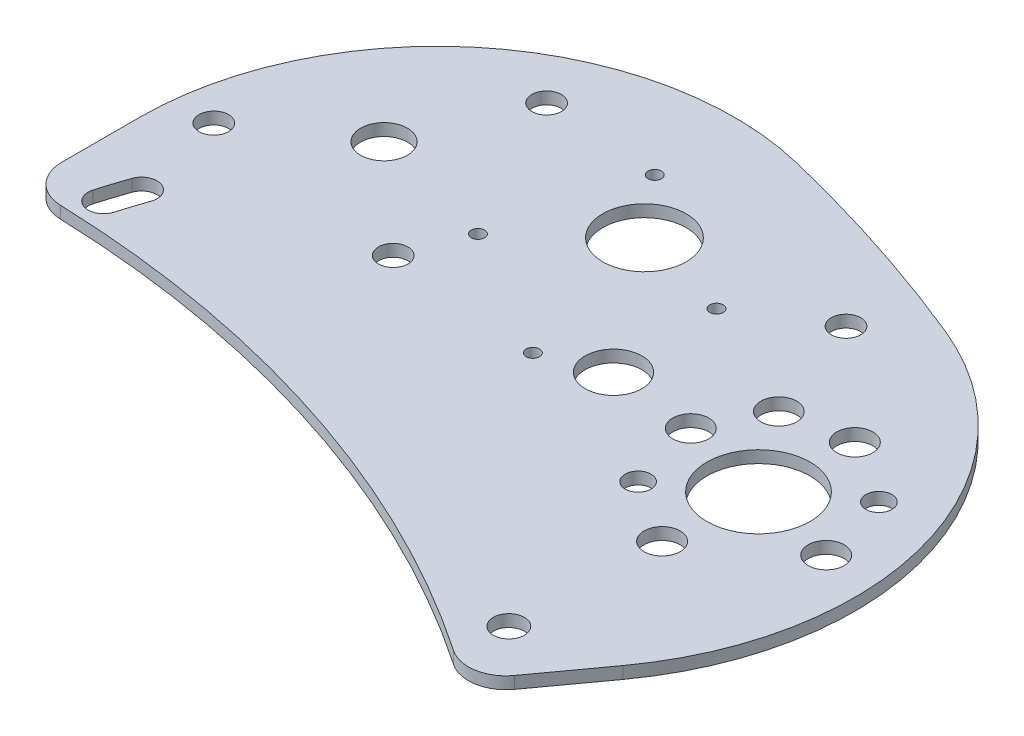
ISO-10303-21;
HEADER;
FILE_DESCRIPTION(('STEP AP214'),'2;1');
FILE_NAME('part.step','',(''),(''),'','','');
FILE_SCHEMA(('AUTOMOTIVE_DESIGN { 1 0 10303 214 1 1 1 1 }'));
ENDSEC;
DATA;
#1=APPLICATION_CONTEXT('core data for automotive mechanical design processes');
#2=APPLICATION_PROTOCOL_DEFINITION('international standard','automotive_design',2000,#1);
#3=PRODUCT_CONTEXT('',#1,'mechanical');
#4=PRODUCT('Part','Part','',(#3));
#5=PRODUCT_RELATED_PRODUCT_CATEGORY('part','',(#4));
#6=PRODUCT_DEFINITION_FORMATION('','',#4);
#7=PRODUCT_DEFINITION_CONTEXT('part definition',#1,'design');
#8=PRODUCT_DEFINITION('design','',#6,#7);
#9=PRODUCT_DEFINITION_SHAPE('','',#8);
#10=(LENGTH_UNIT() NAMED_UNIT(*) SI_UNIT(.MILLI.,.METRE.));
#11=(NAMED_UNIT(*) PLANE_ANGLE_UNIT() SI_UNIT($,.RADIAN.));
#12=(NAMED_UNIT(*) SI_UNIT($,.STERADIAN.) SOLID_ANGLE_UNIT());
#13=UNCERTAINTY_MEASURE_WITH_UNIT(LENGTH_MEASURE(1.E-05),#10,'distance_accuracy_value','');
#14=(GEOMETRIC_REPRESENTATION_CONTEXT(3) GLOBAL_UNCERTAINTY_ASSIGNED_CONTEXT((#13)) GLOBAL_UNIT_ASSIGNED_CONTEXT((#10,
#11,#12)) REPRESENTATION_CONTEXT('',''));
#15=CARTESIAN_POINT('',(0.,0.,0.));
#16=DIRECTION('',(0.,0.,1.));
#17=DIRECTION('',(1.,0.,0.));
#18=AXIS2_PLACEMENT_3D('',#15,#16,#17);
#19=CARTESIAN_POINT('',(0.,0.,0.));
#20=DIRECTION('',(0.,1.,0.));
#21=DIRECTION('',(0.,0.,1.));
#22=AXIS2_PLACEMENT_3D('',#19,#20,#21);
#23=PLANE('',#22);
#24=CARTESIAN_POINT('',(105.387653275408,0.,-162.282754897439));
#25=DIRECTION('',(0.,-1.,0.));
#26=DIRECTION('',(0.,0.,-1.));
#27=AXIS2_PLACEMENT_3D('',#24,#25,#26);
#28=CIRCLE('',#27,97.5467704546758);
#29=CARTESIAN_POINT('',(13.2052435141244,0.,-194.185352859675));
#30=VERTEX_POINT('',#29);
#31=CARTESIAN_POINT('',(11.7062790755721,0.,-189.470482904162));
#32=VERTEX_POINT('',#31);
#33=EDGE_CURVE('E300',#30,#32,#28,.F.);
#34=ORIENTED_EDGE('',*,*,#33,.F.);
#35=CARTESIAN_POINT('',(10.7329154268554,0.,-195.04097910337));
#36=DIRECTION('',(0.,-1.,0.));
#37=DIRECTION('',(0.,0.,-1.));
#38=AXIS2_PLACEMENT_3D('',#35,#36,#37);
#39=CIRCLE('',#38,2.61620000000001);
#40=CARTESIAN_POINT('',(8.26058733958649,0.,-195.896605347066));
#41=VERTEX_POINT('',#40);
#42=EDGE_CURVE('E287',#30,#41,#39,.F.);
#43=ORIENTED_EDGE('',*,*,#42,.T.);
#44=CARTESIAN_POINT('',(105.387653275408,0.,-162.282754897439));
#45=DIRECTION('',(0.,-1.,0.));
#46=DIRECTION('',(0.,0.,-1.));
#47=AXIS2_PLACEMENT_3D('',#44,#45,#46);
#48=CIRCLE('',#47,102.779170454676);
#49=CARTESIAN_POINT('',(6.68121858327241,0.,-190.928830190897));
#50=VERTEX_POINT('',#49);
#51=EDGE_CURVE('E291',#41,#50,#48,.F.);
#52=ORIENTED_EDGE('',*,*,#51,.T.);
#53=CARTESIAN_POINT('',(9.19374882942225,0.,-190.19965654753));
#54=DIRECTION('',(0.,-1.,0.));
#55=DIRECTION('',(0.,0.,-1.));
#56=AXIS2_PLACEMENT_3D('',#53,#54,#55);
#57=CIRCLE('',#56,2.61620000000001);
#58=EDGE_CURVE('E295',#50,#32,#57,.F.);
#59=ORIENTED_EDGE('',*,*,#58,.T.);
#60=EDGE_LOOP('',(#34,#43,#52,#59));
#61=FACE_BOUND('',#60,.T.);
#62=CARTESIAN_POINT('',(6.35,0.,-192.300185972349));
#63=DIRECTION('',(0.,-1.,0.));
#64=DIRECTION('',(0.,0.,-1.));
#65=AXIS2_PLACEMENT_3D('',#62,#63,#64);
#66=CIRCLE('',#65,6.34999999999999);
#67=CARTESIAN_POINT('',(0.,0.,-192.300185972349));
#68=VERTEX_POINT('',#67);
#69=CARTESIAN_POINT('',(6.14042904290429,0.,-185.953645181182));
#70=VERTEX_POINT('',#69);
#71=EDGE_CURVE('E135',#68,#70,#66,.F.);
#72=ORIENTED_EDGE('',*,*,#71,.F.);
#73=DIRECTION('',(0.,0.,-1.));
#74=VECTOR('',#73,1.);
#75=CARTESIAN_POINT('',(0.,0.,-261.62));
#76=LINE('',#75,#74);
#77=CARTESIAN_POINT('',(0.,0.,-205.418328782998));
#78=VERTEX_POINT('',#77);
#79=EDGE_CURVE('E126',#68,#78,#76,.T.);
#80=ORIENTED_EDGE('',*,*,#79,.T.);
#81=CARTESIAN_POINT('',(50.165,0.,-205.418328782998));
#82=DIRECTION('',(0.,-1.,0.));
#83=DIRECTION('',(0.,0.,-1.));
#84=AXIS2_PLACEMENT_3D('',#81,#82,#83);
#85=CIRCLE('',#84,50.165);
#86=CARTESIAN_POINT('',(62.066006006006,0.,-254.151205581367));
#87=VERTEX_POINT('',#86);
#88=EDGE_CURVE('E308',#87,#78,#85,.F.);
#89=ORIENTED_EDGE('',*,*,#88,.F.);
#90=CARTESIAN_POINT('',(0.,0.,0.));
#91=DIRECTION('',(0.,-1.,0.));
#92=DIRECTION('',(0.,0.,-1.));
#93=AXIS2_PLACEMENT_3D('',#90,#91,#92);
#94=CIRCLE('',#93,261.62);
#95=CARTESIAN_POINT('',(99.1738768612441,0.,-242.094127455233));
#96=VERTEX_POINT('',#95);
#97=EDGE_CURVE('E313',#96,#87,#94,.F.);
#98=ORIENTED_EDGE('',*,*,#97,.F.);
#99=CARTESIAN_POINT('',(80.1575266863939,0.,-195.673166122798));
#100=DIRECTION('',(0.,-1.,0.));
#101=DIRECTION('',(0.,0.,-1.));
#102=AXIS2_PLACEMENT_3D('',#99,#100,#101);
#103=CIRCLE('',#102,50.165);
#104=CARTESIAN_POINT('',(120.741864209213,0.,-166.186918941546));
#105=VERTEX_POINT('',#104);
#106=EDGE_CURVE('E318',#105,#96,#103,.F.);
#107=ORIENTED_EDGE('',*,*,#106,.F.);
#108=DIRECTION('',(-0.587785252292475,0.,0.809016994374946));
#109=VECTOR('',#108,1.);
#110=CARTESIAN_POINT('',(153.776377704757,0.,-211.655026068374));
#111=LINE('',#110,#109);
#112=CARTESIAN_POINT('',(113.031213327647,0.,-155.574118473093));
#113=VERTEX_POINT('',#112);
#114=EDGE_CURVE('E171',#105,#113,#111,.T.);
#115=ORIENTED_EDGE('',*,*,#114,.T.);
#116=CARTESIAN_POINT('',(107.893955413366,0.,-159.30655482515));
#117=DIRECTION('',(0.,-1.,0.));
#118=DIRECTION('',(0.,0.,-1.));
#119=AXIS2_PLACEMENT_3D('',#116,#117,#118);
#120=CIRCLE('',#119,6.34999999999999);
#121=CARTESIAN_POINT('',(104.333098799063,0.,-154.048912751713));
#122=VERTEX_POINT('',#121);
#123=EDGE_CURVE('E138',#122,#113,#120,.F.);
#124=ORIENTED_EDGE('',*,*,#123,.F.);
#125=CARTESIAN_POINT('',(0.,0.,0.));
#126=DIRECTION('',(0.,-1.,0.));
#127=DIRECTION('',(0.,0.,-1.));
#128=AXIS2_PLACEMENT_3D('',#125,#126,#127);
#129=CIRCLE('',#128,186.055);
#130=EDGE_CURVE('E132',#122,#70,#129,.F.);
#131=ORIENTED_EDGE('',*,*,#130,.T.);
#132=EDGE_LOOP('',(#72,#80,#89,#98,#107,#115,#124,#131));
#133=FACE_BOUND('',#132,.T.);
#134=CARTESIAN_POINT('',(105.387653275408,0.,-162.282754897439));
#135=DIRECTION('',(0.,-1.,0.));
#136=DIRECTION('',(0.,0.,-1.));
#137=AXIS2_PLACEMENT_3D('',#134,#135,#136);
#138=CIRCLE('',#137,2.61620000000001);
#139=CARTESIAN_POINT('',(105.387653275408,0.,-164.898954897439));
#140=VERTEX_POINT('',#139);
#141=EDGE_CURVE('E303',#140,#140,#138,.F.);
#142=ORIENTED_EDGE('',*,*,#141,.T.);
#143=EDGE_LOOP('',(#142));
#144=FACE_BOUND('',#143,.T.);
#145=CARTESIAN_POINT('',(106.79327598966,0.,-202.949339878046));
#146=DIRECTION('',(0.,1.,0.));
#147=DIRECTION('',(0.,0.,1.));
#148=AXIS2_PLACEMENT_3D('',#145,#146,#147);
#149=CIRCLE('',#148,8.68679999999994);
#150=CARTESIAN_POINT('',(106.79327598966,0.,-194.262539878046));
#151=VERTEX_POINT('',#150);
#152=EDGE_CURVE('E170',#151,#151,#149,.T.);
#153=ORIENTED_EDGE('',*,*,#152,.T.);
#154=EDGE_LOOP('',(#153));
#155=FACE_BOUND('',#154,.T.);
#156=CARTESIAN_POINT('',(96.7903973229225,0.,-216.384551797347));
#157=DIRECTION('',(0.,1.,0.));
#158=DIRECTION('',(0.,0.,1.));
#159=AXIS2_PLACEMENT_3D('',#156,#157,#158);
#160=CIRCLE('',#159,3.02260000000004);
#161=CARTESIAN_POINT('',(96.7903973229225,0.,-213.361951797347));
#162=VERTEX_POINT('',#161);
#163=EDGE_CURVE('E328',#162,#162,#160,.T.);
#164=ORIENTED_EDGE('',*,*,#163,.T.);
#165=EDGE_LOOP('',(#164));
#166=FACE_BOUND('',#165,.T.);
#167=CARTESIAN_POINT('',(77.135845718805,0.,-208.175495559979));
#168=DIRECTION('',(0.,1.,0.));
#169=DIRECTION('',(0.,0.,1.));
#170=AXIS2_PLACEMENT_3D('',#167,#168,#169);
#171=CIRCLE('',#170,4.78790000000001);
#172=CARTESIAN_POINT('',(77.135845718805,0.,-203.387595559979));
#173=VERTEX_POINT('',#172);
#174=EDGE_CURVE('E332',#173,#173,#171,.T.);
#175=ORIENTED_EDGE('',*,*,#174,.T.);
#176=EDGE_LOOP('',(#175));
#177=FACE_BOUND('',#176,.T.);
#178=CARTESIAN_POINT('',(60.1187805087684,0.,-230.411041087745));
#179=DIRECTION('',(0.,1.,0.));
#180=DIRECTION('',(0.,0.,1.));
#181=AXIS2_PLACEMENT_3D('',#178,#179,#180);
#182=CIRCLE('',#181,7.0231);
#183=CARTESIAN_POINT('',(60.1187805087684,0.,-223.387941087745));
#184=VERTEX_POINT('',#183);
#185=EDGE_CURVE('E336',#184,#184,#182,.T.);
#186=ORIENTED_EDGE('',*,*,#185,.T.);
#187=EDGE_LOOP('',(#186));
#188=FACE_BOUND('',#187,.T.);
#189=CARTESIAN_POINT('',(24.1516933288154,0.,-222.485289401648));
#190=DIRECTION('',(0.,1.,0.));
#191=DIRECTION('',(0.,0.,1.));
#192=AXIS2_PLACEMENT_3D('',#189,#190,#191);
#193=CIRCLE('',#192,3.9497);
#194=CARTESIAN_POINT('',(24.1516933288154,0.,-218.535589401648));
#195=VERTEX_POINT('',#194);
#196=EDGE_CURVE('E340',#195,#195,#193,.T.);
#197=ORIENTED_EDGE('',*,*,#196,.T.);
#198=EDGE_LOOP('',(#197));
#199=FACE_BOUND('',#198,.T.);
#200=CARTESIAN_POINT('',(7.09853202549333,0.,-210.855395159311));
#201=DIRECTION('',(0.,1.,0.));
#202=DIRECTION('',(0.,0.,1.));
#203=AXIS2_PLACEMENT_3D('',#200,#201,#202);
#204=CIRCLE('',#203,2.48920000000002);
#205=CARTESIAN_POINT('',(7.09853202549333,0.,-208.366195159311));
#206=VERTEX_POINT('',#205);
#207=EDGE_CURVE('E344',#206,#206,#204,.T.);
#208=ORIENTED_EDGE('',*,*,#207,.T.);
#209=EDGE_LOOP('',(#208));
#210=FACE_BOUND('',#209,.T.);
#211=CARTESIAN_POINT('',(118.423757894917,0.,-211.608548235366));
#212=DIRECTION('',(0.,1.,0.));
#213=DIRECTION('',(0.,0.,1.));
#214=AXIS2_PLACEMENT_3D('',#211,#212,#213);
#215=CIRCLE('',#214,2.18439999999998);
#216=CARTESIAN_POINT('',(118.423757894917,0.,-209.424148235366));
#217=VERTEX_POINT('',#216);
#218=EDGE_CURVE('E348',#217,#217,#215,.T.);
#219=ORIENTED_EDGE('',*,*,#218,.T.);
#220=EDGE_LOOP('',(#219));
#221=FACE_BOUND('',#220,.T.);
#222=CARTESIAN_POINT('',(95.1627940844023,0.,-194.290131520727));
#223=DIRECTION('',(0.,1.,0.));
#224=DIRECTION('',(0.,0.,1.));
#225=AXIS2_PLACEMENT_3D('',#222,#223,#224);
#226=CIRCLE('',#225,2.18439999999998);
#227=CARTESIAN_POINT('',(95.1627940844023,0.,-192.105731520727));
#228=VERTEX_POINT('',#227);
#229=EDGE_CURVE('E352',#228,#228,#226,.T.);
#230=ORIENTED_EDGE('',*,*,#229,.T.);
#231=EDGE_LOOP('',(#230));
#232=FACE_BOUND('',#231,.T.);
#233=CARTESIAN_POINT('',(107.686248355767,0.,-218.290372742667));
#234=DIRECTION('',(0.,1.,0.));
#235=DIRECTION('',(0.,0.,1.));
#236=AXIS2_PLACEMENT_3D('',#233,#234,#235);
#237=CIRCLE('',#236,3.03809996899998);
#238=CARTESIAN_POINT('',(107.686248355767,0.,-215.252272773667));
#239=VERTEX_POINT('',#238);
#240=EDGE_CURVE('E356',#239,#239,#237,.T.);
#241=ORIENTED_EDGE('',*,*,#240,.T.);
#242=EDGE_LOOP('',(#241));
#243=FACE_BOUND('',#242,.T.);
#244=CARTESIAN_POINT('',(91.8403709094479,0.,-206.492688387885));
#245=DIRECTION('',(0.,1.,0.));
#246=DIRECTION('',(0.,0.,1.));
#247=AXIS2_PLACEMENT_3D('',#244,#245,#246);
#248=CIRCLE('',#247,3.03809996899998);
#249=CARTESIAN_POINT('',(91.8403709094479,0.,-203.454588418885));
#250=VERTEX_POINT('',#249);
#251=EDGE_CURVE('E360',#250,#250,#248,.T.);
#252=ORIENTED_EDGE('',*,*,#251,.T.);
#253=EDGE_LOOP('',(#252));
#254=FACE_BOUND('',#253,.T.);
#255=CARTESIAN_POINT('',(105.900303623552,0.,-187.608307013426));
#256=DIRECTION('',(0.,1.,0.));
#257=DIRECTION('',(0.,0.,1.));
#258=AXIS2_PLACEMENT_3D('',#255,#256,#257);
#259=CIRCLE('',#258,3.03809996899998);
#260=CARTESIAN_POINT('',(105.900303623552,0.,-184.570207044426));
#261=VERTEX_POINT('',#260);
#262=EDGE_CURVE('E364',#261,#261,#259,.T.);
#263=ORIENTED_EDGE('',*,*,#262,.T.);
#264=EDGE_LOOP('',(#263));
#265=FACE_BOUND('',#264,.T.);
#266=CARTESIAN_POINT('',(121.746181069872,0.,-199.405991368208));
#267=DIRECTION('',(0.,1.,0.));
#268=DIRECTION('',(0.,0.,1.));
#269=AXIS2_PLACEMENT_3D('',#266,#267,#268);
#270=CIRCLE('',#269,3.03809996899998);
#271=CARTESIAN_POINT('',(121.746181069872,0.,-196.367891399208));
#272=VERTEX_POINT('',#271);
#273=EDGE_CURVE('E368',#272,#272,#270,.T.);
#274=ORIENTED_EDGE('',*,*,#273,.T.);
#275=EDGE_LOOP('',(#274));
#276=FACE_BOUND('',#275,.T.);
#277=CARTESIAN_POINT('',(90.0057910219011,0.,-234.478350866689));
#278=DIRECTION('',(0.,1.,0.));
#279=DIRECTION('',(0.,0.,1.));
#280=AXIS2_PLACEMENT_3D('',#277,#278,#279);
#281=CIRCLE('',#280,2.48920000000002);
#282=CARTESIAN_POINT('',(90.0057910219011,0.,-231.989150866689));
#283=VERTEX_POINT('',#282);
#284=EDGE_CURVE('E372',#283,#283,#281,.T.);
#285=ORIENTED_EDGE('',*,*,#284,.T.);
#286=EDGE_LOOP('',(#285));
#287=FACE_BOUND('',#286,.T.);
#288=CARTESIAN_POINT('',(32.202215271751,0.,-241.832152750685));
#289=DIRECTION('',(0.,1.,0.));
#290=DIRECTION('',(0.,0.,1.));
#291=AXIS2_PLACEMENT_3D('',#288,#289,#290);
#292=CIRCLE('',#291,2.4892);
#293=CARTESIAN_POINT('',(32.202215271751,0.,-239.342952750685));
#294=VERTEX_POINT('',#293);
#295=EDGE_CURVE('E376',#294,#294,#292,.T.);
#296=ORIENTED_EDGE('',*,*,#295,.T.);
#297=EDGE_LOOP('',(#296));
#298=FACE_BOUND('',#297,.T.);
#299=CARTESIAN_POINT('',(41.5214088040088,0.,-206.664163989377));
#300=DIRECTION('',(0.,1.,0.));
#301=DIRECTION('',(0.,0.,1.));
#302=AXIS2_PLACEMENT_3D('',#299,#300,#301);
#303=CIRCLE('',#302,2.4892);
#304=CARTESIAN_POINT('',(41.5214088040088,0.,-204.174963989377));
#305=VERTEX_POINT('',#304);
#306=EDGE_CURVE('E380',#305,#305,#303,.T.);
#307=ORIENTED_EDGE('',*,*,#306,.T.);
#308=EDGE_LOOP('',(#307));
#309=FACE_BOUND('',#308,.T.);
#310=CARTESIAN_POINT('',(45.5231581875763,0.,-216.941652759853));
#311=DIRECTION('',(0.,1.,0.));
#312=DIRECTION('',(0.,0.,1.));
#313=AXIS2_PLACEMENT_3D('',#310,#311,#312);
#314=CIRCLE('',#313,1.1303);
#315=CARTESIAN_POINT('',(45.5231581875763,0.,-215.811352759852));
#316=VERTEX_POINT('',#315);
#317=EDGE_CURVE('E384',#316,#316,#314,.T.);
#318=ORIENTED_EDGE('',*,*,#317,.T.);
#319=EDGE_LOOP('',(#318));
#320=FACE_BOUND('',#319,.T.);
#321=CARTESIAN_POINT('',(51.8012961391148,0.,-240.455957105536));
#322=DIRECTION('',(0.,1.,0.));
#323=DIRECTION('',(0.,0.,1.));
#324=AXIS2_PLACEMENT_3D('',#321,#322,#323);
#325=CIRCLE('',#324,1.1303);
#326=CARTESIAN_POINT('',(51.8012961391148,0.,-239.325657105536));
#327=VERTEX_POINT('',#326);
#328=EDGE_CURVE('E388',#327,#327,#325,.T.);
#329=ORIENTED_EDGE('',*,*,#328,.T.);
#330=EDGE_LOOP('',(#329));
#331=FACE_BOUND('',#330,.T.);
#332=CARTESIAN_POINT('',(67.5040399105149,0.,-204.21369775199));
#333=DIRECTION('',(0.,1.,0.));
#334=DIRECTION('',(0.,0.,1.));
#335=AXIS2_PLACEMENT_3D('',#332,#333,#334);
#336=CIRCLE('',#335,1.1303);
#337=CARTESIAN_POINT('',(67.5040399105149,0.,-203.08339775199));
#338=VERTEX_POINT('',#337);
#339=EDGE_CURVE('E391',#338,#338,#336,.T.);
#340=ORIENTED_EDGE('',*,*,#339,.T.);
#341=EDGE_LOOP('',(#340));
#342=FACE_BOUND('',#341,.T.);
#343=CARTESIAN_POINT('',(76.5297880774208,0.,-226.137007721691));
#344=DIRECTION('',(0.,1.,0.));
#345=DIRECTION('',(0.,0.,1.));
#346=AXIS2_PLACEMENT_3D('',#343,#344,#345);
#347=CIRCLE('',#346,1.1303);
#348=CARTESIAN_POINT('',(76.5297880774208,0.,-225.006707721691));
#349=VERTEX_POINT('',#348);
#350=EDGE_CURVE('E19',#349,#349,#347,.T.);
#351=ORIENTED_EDGE('',*,*,#350,.T.);
#352=EDGE_LOOP('',(#351));
#353=FACE_BOUND('',#352,.T.);
#354=ADVANCED_FACE('F16',(#61,#133,#144,#155,#166,#177,#188,#199,#210,#221,#232,#243,#254,#265,
#276,#287,#298,#309,#320,#331,#342,#353),#23,.F.);
#355=CARTESIAN_POINT('',(76.5297880774208,2.032,-226.137007721691));
#356=DIRECTION('',(0.,1.,0.));
#357=DIRECTION('',(0.,0.,1.));
#358=AXIS2_PLACEMENT_3D('',#355,#356,#357);
#359=CYLINDRICAL_SURFACE('',#358,1.1303);
#360=CARTESIAN_POINT('',(76.5297880774208,2.032,-226.137007721691));
#361=DIRECTION('',(0.,1.,0.));
#362=DIRECTION('',(0.,0.,1.));
#363=AXIS2_PLACEMENT_3D('',#360,#361,#362);
#364=CIRCLE('',#363,1.1303);
#365=CARTESIAN_POINT('',(76.5297880774208,2.032,-225.006707721691));
#366=VERTEX_POINT('',#365);
#367=EDGE_CURVE('E283',#366,#366,#364,.F.);
#368=ORIENTED_EDGE('',*,*,#367,.F.);
#369=EDGE_LOOP('',(#368));
#370=FACE_BOUND('',#369,.T.);
#371=ORIENTED_EDGE('',*,*,#350,.F.);
#372=EDGE_LOOP('',(#371));
#373=FACE_BOUND('',#372,.T.);
#374=ADVANCED_FACE('F401',(#370,#373),#359,.F.);
#375=CARTESIAN_POINT('',(67.5040399105149,2.032,-204.21369775199));
#376=DIRECTION('',(0.,1.,0.));
#377=DIRECTION('',(0.,0.,1.));
#378=AXIS2_PLACEMENT_3D('',#375,#376,#377);
#379=CYLINDRICAL_SURFACE('',#378,1.1303);
#380=CARTESIAN_POINT('',(67.5040399105149,2.032,-204.21369775199));
#381=DIRECTION('',(0.,1.,0.));
#382=DIRECTION('',(0.,0.,1.));
#383=AXIS2_PLACEMENT_3D('',#380,#381,#382);
#384=CIRCLE('',#383,1.1303);
#385=CARTESIAN_POINT('',(67.5040399105149,2.032,-203.08339775199));
#386=VERTEX_POINT('',#385);
#387=EDGE_CURVE('E279',#386,#386,#384,.F.);
#388=ORIENTED_EDGE('',*,*,#387,.F.);
#389=EDGE_LOOP('',(#388));
#390=FACE_BOUND('',#389,.T.);
#391=ORIENTED_EDGE('',*,*,#339,.F.);
#392=EDGE_LOOP('',(#391));
#393=FACE_BOUND('',#392,.T.);
#394=ADVANCED_FACE('F403',(#390,#393),#379,.F.);
#395=CARTESIAN_POINT('',(51.8012961391148,2.032,-240.455957105536));
#396=DIRECTION('',(0.,1.,0.));
#397=DIRECTION('',(0.,0.,1.));
#398=AXIS2_PLACEMENT_3D('',#395,#396,#397);
#399=CYLINDRICAL_SURFACE('',#398,1.1303);
#400=CARTESIAN_POINT('',(51.8012961391148,2.032,-240.455957105536));
#401=DIRECTION('',(0.,1.,0.));
#402=DIRECTION('',(0.,0.,1.));
#403=AXIS2_PLACEMENT_3D('',#400,#401,#402);
#404=CIRCLE('',#403,1.1303);
#405=CARTESIAN_POINT('',(51.8012961391148,2.032,-239.325657105536));
#406=VERTEX_POINT('',#405);
#407=EDGE_CURVE('E275',#406,#406,#404,.F.);
#408=ORIENTED_EDGE('',*,*,#407,.F.);
#409=EDGE_LOOP('',(#408));
#410=FACE_BOUND('',#409,.T.);
#411=ORIENTED_EDGE('',*,*,#328,.F.);
#412=EDGE_LOOP('',(#411));
#413=FACE_BOUND('',#412,.T.);
#414=ADVANCED_FACE('F410',(#410,#413),#399,.F.);
#415=CARTESIAN_POINT('',(45.5231581875763,2.032,-216.941652759853));
#416=DIRECTION('',(0.,1.,0.));
#417=DIRECTION('',(0.,0.,1.));
#418=AXIS2_PLACEMENT_3D('',#415,#416,#417);
#419=CYLINDRICAL_SURFACE('',#418,1.1303);
#420=CARTESIAN_POINT('',(45.5231581875763,2.032,-216.941652759853));
#421=DIRECTION('',(0.,1.,0.));
#422=DIRECTION('',(0.,0.,1.));
#423=AXIS2_PLACEMENT_3D('',#420,#421,#422);
#424=CIRCLE('',#423,1.1303);
#425=CARTESIAN_POINT('',(45.5231581875763,2.032,-215.811352759852));
#426=VERTEX_POINT('',#425);
#427=EDGE_CURVE('E271',#426,#426,#424,.F.);
#428=ORIENTED_EDGE('',*,*,#427,.F.);
#429=EDGE_LOOP('',(#428));
#430=FACE_BOUND('',#429,.T.);
#431=ORIENTED_EDGE('',*,*,#317,.F.);
#432=EDGE_LOOP('',(#431));
#433=FACE_BOUND('',#432,.T.);
#434=ADVANCED_FACE('F529',(#430,#433),#419,.F.);
#435=CARTESIAN_POINT('',(41.5214088040088,-7.04052079891829,-206.664163989377));
#436=DIRECTION('',(0.,1.,0.));
#437=DIRECTION('',(0.,0.,1.));
#438=AXIS2_PLACEMENT_3D('',#435,#436,#437);
#439=CYLINDRICAL_SURFACE('',#438,2.4892);
#440=CARTESIAN_POINT('',(41.5214088040088,2.032,-206.664163989377));
#441=DIRECTION('',(0.,1.,0.));
#442=DIRECTION('',(0.,0.,1.));
#443=AXIS2_PLACEMENT_3D('',#440,#441,#442);
#444=CIRCLE('',#443,2.4892);
#445=CARTESIAN_POINT('',(41.5214088040088,2.032,-204.174963989377));
#446=VERTEX_POINT('',#445);
#447=EDGE_CURVE('E267',#446,#446,#444,.F.);
#448=ORIENTED_EDGE('',*,*,#447,.F.);
#449=EDGE_LOOP('',(#448));
#450=FACE_BOUND('',#449,.T.);
#451=ORIENTED_EDGE('',*,*,#306,.F.);
#452=EDGE_LOOP('',(#451));
#453=FACE_BOUND('',#452,.T.);
#454=ADVANCED_FACE('F525',(#450,#453),#439,.F.);
#455=CARTESIAN_POINT('',(32.202215271751,-7.04052079891829,-241.832152750685));
#456=DIRECTION('',(0.,1.,0.));
#457=DIRECTION('',(0.,0.,1.));
#458=AXIS2_PLACEMENT_3D('',#455,#456,#457);
#459=CYLINDRICAL_SURFACE('',#458,2.4892);
#460=CARTESIAN_POINT('',(32.202215271751,2.032,-241.832152750685));
#461=DIRECTION('',(0.,1.,0.));
#462=DIRECTION('',(0.,0.,1.));
#463=AXIS2_PLACEMENT_3D('',#460,#461,#462);
#464=CIRCLE('',#463,2.4892);
#465=CARTESIAN_POINT('',(32.202215271751,2.032,-239.342952750685));
#466=VERTEX_POINT('',#465);
#467=EDGE_CURVE('E263',#466,#466,#464,.F.);
#468=ORIENTED_EDGE('',*,*,#467,.F.);
#469=EDGE_LOOP('',(#468));
#470=FACE_BOUND('',#469,.T.);
#471=ORIENTED_EDGE('',*,*,#295,.F.);
#472=EDGE_LOOP('',(#471));
#473=FACE_BOUND('',#472,.T.);
#474=ADVANCED_FACE('F521',(#470,#473),#459,.F.);
#475=CARTESIAN_POINT('',(90.0057910219011,-7.04052079891829,-234.478350866689));
#476=DIRECTION('',(0.,1.,0.));
#477=DIRECTION('',(0.,0.,1.));
#478=AXIS2_PLACEMENT_3D('',#475,#476,#477);
#479=CYLINDRICAL_SURFACE('',#478,2.48920000000002);
#480=CARTESIAN_POINT('',(90.0057910219011,2.032,-234.478350866689));
#481=DIRECTION('',(0.,1.,0.));
#482=DIRECTION('',(0.,0.,1.));
#483=AXIS2_PLACEMENT_3D('',#480,#481,#482);
#484=CIRCLE('',#483,2.48920000000002);
#485=CARTESIAN_POINT('',(90.0057910219011,2.032,-231.989150866689));
#486=VERTEX_POINT('',#485);
#487=EDGE_CURVE('E259',#486,#486,#484,.F.);
#488=ORIENTED_EDGE('',*,*,#487,.F.);
#489=EDGE_LOOP('',(#488));
#490=FACE_BOUND('',#489,.T.);
#491=ORIENTED_EDGE('',*,*,#284,.F.);
#492=EDGE_LOOP('',(#491));
#493=FACE_BOUND('',#492,.T.);
#494=ADVANCED_FACE('F517',(#490,#493),#479,.F.);
#495=CARTESIAN_POINT('',(121.746181069872,-8.59304436001012,-199.405991368208));
#496=DIRECTION('',(0.,1.,0.));
#497=DIRECTION('',(0.,0.,1.));
#498=AXIS2_PLACEMENT_3D('',#495,#496,#497);
#499=CYLINDRICAL_SURFACE('',#498,3.03809996899998);
#500=CARTESIAN_POINT('',(121.746181069872,2.032,-199.405991368208));
#501=DIRECTION('',(0.,1.,0.));
#502=DIRECTION('',(0.,0.,1.));
#503=AXIS2_PLACEMENT_3D('',#500,#501,#502);
#504=CIRCLE('',#503,3.03809996899998);
#505=CARTESIAN_POINT('',(121.746181069872,2.032,-196.367891399208));
#506=VERTEX_POINT('',#505);
#507=EDGE_CURVE('E255',#506,#506,#504,.F.);
#508=ORIENTED_EDGE('',*,*,#507,.F.);
#509=EDGE_LOOP('',(#508));
#510=FACE_BOUND('',#509,.T.);
#511=ORIENTED_EDGE('',*,*,#273,.F.);
#512=EDGE_LOOP('',(#511));
#513=FACE_BOUND('',#512,.T.);
#514=ADVANCED_FACE('F513',(#510,#513),#499,.F.);
#515=CARTESIAN_POINT('',(105.900303623552,-8.59304436001012,-187.608307013426));
#516=DIRECTION('',(0.,1.,0.));
#517=DIRECTION('',(0.,0.,1.));
#518=AXIS2_PLACEMENT_3D('',#515,#516,#517);
#519=CYLINDRICAL_SURFACE('',#518,3.03809996899998);
#520=CARTESIAN_POINT('',(105.900303623552,2.032,-187.608307013426));
#521=DIRECTION('',(0.,1.,0.));
#522=DIRECTION('',(0.,0.,1.));
#523=AXIS2_PLACEMENT_3D('',#520,#521,#522);
#524=CIRCLE('',#523,3.03809996899998);
#525=CARTESIAN_POINT('',(105.900303623552,2.032,-184.570207044426));
#526=VERTEX_POINT('',#525);
#527=EDGE_CURVE('E251',#526,#526,#524,.F.);
#528=ORIENTED_EDGE('',*,*,#527,.F.);
#529=EDGE_LOOP('',(#528));
#530=FACE_BOUND('',#529,.T.);
#531=ORIENTED_EDGE('',*,*,#262,.F.);
#532=EDGE_LOOP('',(#531));
#533=FACE_BOUND('',#532,.T.);
#534=ADVANCED_FACE('F509',(#530,#533),#519,.F.);
#535=CARTESIAN_POINT('',(91.8403709094479,-8.59304436001012,-206.492688387885));
#536=DIRECTION('',(0.,1.,0.));
#537=DIRECTION('',(0.,0.,1.));
#538=AXIS2_PLACEMENT_3D('',#535,#536,#537);
#539=CYLINDRICAL_SURFACE('',#538,3.03809996899998);
#540=CARTESIAN_POINT('',(91.8403709094479,2.032,-206.492688387885));
#541=DIRECTION('',(0.,1.,0.));
#542=DIRECTION('',(0.,0.,1.));
#543=AXIS2_PLACEMENT_3D('',#540,#541,#542);
#544=CIRCLE('',#543,3.03809996899998);
#545=CARTESIAN_POINT('',(91.8403709094479,2.032,-203.454588418885));
#546=VERTEX_POINT('',#545);
#547=EDGE_CURVE('E247',#546,#546,#544,.F.);
#548=ORIENTED_EDGE('',*,*,#547,.F.);
#549=EDGE_LOOP('',(#548));
#550=FACE_BOUND('',#549,.T.);
#551=ORIENTED_EDGE('',*,*,#251,.F.);
#552=EDGE_LOOP('',(#551));
#553=FACE_BOUND('',#552,.T.);
#554=ADVANCED_FACE('F505',(#550,#553),#539,.F.);
#555=CARTESIAN_POINT('',(107.686248355767,-8.59304436001012,-218.290372742667));
#556=DIRECTION('',(0.,1.,0.));
#557=DIRECTION('',(0.,0.,1.));
#558=AXIS2_PLACEMENT_3D('',#555,#556,#557);
#559=CYLINDRICAL_SURFACE('',#558,3.03809996899998);
#560=CARTESIAN_POINT('',(107.686248355767,2.032,-218.290372742667));
#561=DIRECTION('',(0.,1.,0.));
#562=DIRECTION('',(0.,0.,1.));
#563=AXIS2_PLACEMENT_3D('',#560,#561,#562);
#564=CIRCLE('',#563,3.03809996899998);
#565=CARTESIAN_POINT('',(107.686248355767,2.032,-215.252272773667));
#566=VERTEX_POINT('',#565);
#567=EDGE_CURVE('E243',#566,#566,#564,.F.);
#568=ORIENTED_EDGE('',*,*,#567,.F.);
#569=EDGE_LOOP('',(#568));
#570=FACE_BOUND('',#569,.T.);
#571=ORIENTED_EDGE('',*,*,#240,.F.);
#572=EDGE_LOOP('',(#571));
#573=FACE_BOUND('',#572,.T.);
#574=ADVANCED_FACE('F501',(#570,#573),#559,.F.);
#575=CARTESIAN_POINT('',(95.1627940844023,-8.59304436001012,-194.290131520727));
#576=DIRECTION('',(0.,1.,0.));
#577=DIRECTION('',(0.,0.,1.));
#578=AXIS2_PLACEMENT_3D('',#575,#576,#577);
#579=CYLINDRICAL_SURFACE('',#578,2.18439999999998);
#580=CARTESIAN_POINT('',(95.1627940844023,2.032,-194.290131520727));
#581=DIRECTION('',(0.,1.,0.));
#582=DIRECTION('',(0.,0.,1.));
#583=AXIS2_PLACEMENT_3D('',#580,#581,#582);
#584=CIRCLE('',#583,2.18439999999998);
#585=CARTESIAN_POINT('',(95.1627940844023,2.032,-192.105731520727));
#586=VERTEX_POINT('',#585);
#587=EDGE_CURVE('E239',#586,#586,#584,.F.);
#588=ORIENTED_EDGE('',*,*,#587,.F.);
#589=EDGE_LOOP('',(#588));
#590=FACE_BOUND('',#589,.T.);
#591=ORIENTED_EDGE('',*,*,#229,.F.);
#592=EDGE_LOOP('',(#591));
#593=FACE_BOUND('',#592,.T.);
#594=ADVANCED_FACE('F497',(#590,#593),#579,.F.);
#595=CARTESIAN_POINT('',(118.423757894917,-8.59304436001012,-211.608548235366));
#596=DIRECTION('',(0.,1.,0.));
#597=DIRECTION('',(0.,0.,1.));
#598=AXIS2_PLACEMENT_3D('',#595,#596,#597);
#599=CYLINDRICAL_SURFACE('',#598,2.18439999999998);
#600=CARTESIAN_POINT('',(118.423757894917,2.032,-211.608548235366));
#601=DIRECTION('',(0.,1.,0.));
#602=DIRECTION('',(0.,0.,1.));
#603=AXIS2_PLACEMENT_3D('',#600,#601,#602);
#604=CIRCLE('',#603,2.18439999999998);
#605=CARTESIAN_POINT('',(118.423757894917,2.032,-209.424148235366));
#606=VERTEX_POINT('',#605);
#607=EDGE_CURVE('E235',#606,#606,#604,.F.);
#608=ORIENTED_EDGE('',*,*,#607,.F.);
#609=EDGE_LOOP('',(#608));
#610=FACE_BOUND('',#609,.T.);
#611=ORIENTED_EDGE('',*,*,#218,.F.);
#612=EDGE_LOOP('',(#611));
#613=FACE_BOUND('',#612,.T.);
#614=ADVANCED_FACE('F493',(#610,#613),#599,.F.);
#615=CARTESIAN_POINT('',(7.09853202549333,-24.5699807472451,-210.855395159311));
#616=DIRECTION('',(0.,1.,0.));
#617=DIRECTION('',(0.,0.,1.));
#618=AXIS2_PLACEMENT_3D('',#615,#616,#617);
#619=CYLINDRICAL_SURFACE('',#618,2.48920000000002);
#620=CARTESIAN_POINT('',(7.09853202549333,2.032,-210.855395159311));
#621=DIRECTION('',(0.,1.,0.));
#622=DIRECTION('',(0.,0.,1.));
#623=AXIS2_PLACEMENT_3D('',#620,#621,#622);
#624=CIRCLE('',#623,2.48920000000002);
#625=CARTESIAN_POINT('',(7.09853202549333,2.032,-208.366195159311));
#626=VERTEX_POINT('',#625);
#627=EDGE_CURVE('E231',#626,#626,#624,.F.);
#628=ORIENTED_EDGE('',*,*,#627,.F.);
#629=EDGE_LOOP('',(#628));
#630=FACE_BOUND('',#629,.T.);
#631=ORIENTED_EDGE('',*,*,#207,.F.);
#632=EDGE_LOOP('',(#631));
#633=FACE_BOUND('',#632,.T.);
#634=ADVANCED_FACE('F489',(#630,#633),#619,.F.);
#635=CARTESIAN_POINT('',(24.1516933288154,-24.5699807472451,-222.485289401648));
#636=DIRECTION('',(0.,1.,0.));
#637=DIRECTION('',(0.,0.,1.));
#638=AXIS2_PLACEMENT_3D('',#635,#636,#637);
#639=CYLINDRICAL_SURFACE('',#638,3.9497);
#640=CARTESIAN_POINT('',(24.1516933288154,2.032,-222.485289401648));
#641=DIRECTION('',(0.,1.,0.));
#642=DIRECTION('',(0.,0.,1.));
#643=AXIS2_PLACEMENT_3D('',#640,#641,#642);
#644=CIRCLE('',#643,3.9497);
#645=CARTESIAN_POINT('',(24.1516933288154,2.032,-218.535589401648));
#646=VERTEX_POINT('',#645);
#647=EDGE_CURVE('E227',#646,#646,#644,.F.);
#648=ORIENTED_EDGE('',*,*,#647,.F.);
#649=EDGE_LOOP('',(#648));
#650=FACE_BOUND('',#649,.T.);
#651=ORIENTED_EDGE('',*,*,#196,.F.);
#652=EDGE_LOOP('',(#651));
#653=FACE_BOUND('',#652,.T.);
#654=ADVANCED_FACE('F485',(#650,#653),#639,.F.);
#655=CARTESIAN_POINT('',(60.1187805087684,-24.5699807472451,-230.411041087745));
#656=DIRECTION('',(0.,1.,0.));
#657=DIRECTION('',(0.,0.,1.));
#658=AXIS2_PLACEMENT_3D('',#655,#656,#657);
#659=CYLINDRICAL_SURFACE('',#658,7.0231);
#660=CARTESIAN_POINT('',(60.1187805087684,2.032,-230.411041087745));
#661=DIRECTION('',(0.,1.,0.));
#662=DIRECTION('',(0.,0.,1.));
#663=AXIS2_PLACEMENT_3D('',#660,#661,#662);
#664=CIRCLE('',#663,7.0231);
#665=CARTESIAN_POINT('',(60.1187805087684,2.032,-223.387941087745));
#666=VERTEX_POINT('',#665);
#667=EDGE_CURVE('E223',#666,#666,#664,.F.);
#668=ORIENTED_EDGE('',*,*,#667,.F.);
#669=EDGE_LOOP('',(#668));
#670=FACE_BOUND('',#669,.T.);
#671=ORIENTED_EDGE('',*,*,#185,.F.);
#672=EDGE_LOOP('',(#671));
#673=FACE_BOUND('',#672,.T.);
#674=ADVANCED_FACE('F481',(#670,#673),#659,.F.);
#675=CARTESIAN_POINT('',(77.135845718805,-24.5699807472451,-208.175495559979));
#676=DIRECTION('',(0.,1.,0.));
#677=DIRECTION('',(0.,0.,1.));
#678=AXIS2_PLACEMENT_3D('',#675,#676,#677);
#679=CYLINDRICAL_SURFACE('',#678,4.78790000000001);
#680=CARTESIAN_POINT('',(77.135845718805,2.032,-208.175495559979));
#681=DIRECTION('',(0.,1.,0.));
#682=DIRECTION('',(0.,0.,1.));
#683=AXIS2_PLACEMENT_3D('',#680,#681,#682);
#684=CIRCLE('',#683,4.78790000000001);
#685=CARTESIAN_POINT('',(77.135845718805,2.032,-203.387595559979));
#686=VERTEX_POINT('',#685);
#687=EDGE_CURVE('E219',#686,#686,#684,.F.);
#688=ORIENTED_EDGE('',*,*,#687,.F.);
#689=EDGE_LOOP('',(#688));
#690=FACE_BOUND('',#689,.T.);
#691=ORIENTED_EDGE('',*,*,#174,.F.);
#692=EDGE_LOOP('',(#691));
#693=FACE_BOUND('',#692,.T.);
#694=ADVANCED_FACE('F477',(#690,#693),#679,.F.);
#695=CARTESIAN_POINT('',(96.7903973229225,-24.5699807472451,-216.384551797347));
#696=DIRECTION('',(0.,1.,0.));
#697=DIRECTION('',(0.,0.,1.));
#698=AXIS2_PLACEMENT_3D('',#695,#696,#697);
#699=CYLINDRICAL_SURFACE('',#698,3.02260000000004);
#700=CARTESIAN_POINT('',(96.7903973229225,2.032,-216.384551797347));
#701=DIRECTION('',(0.,1.,0.));
#702=DIRECTION('',(0.,0.,1.));
#703=AXIS2_PLACEMENT_3D('',#700,#701,#702);
#704=CIRCLE('',#703,3.02260000000004);
#705=CARTESIAN_POINT('',(96.7903973229225,2.032,-213.361951797347));
#706=VERTEX_POINT('',#705);
#707=EDGE_CURVE('E215',#706,#706,#704,.F.);
#708=ORIENTED_EDGE('',*,*,#707,.F.);
#709=EDGE_LOOP('',(#708));
#710=FACE_BOUND('',#709,.T.);
#711=ORIENTED_EDGE('',*,*,#163,.F.);
#712=EDGE_LOOP('',(#711));
#713=FACE_BOUND('',#712,.T.);
#714=ADVANCED_FACE('F473',(#710,#713),#699,.F.);
#715=CARTESIAN_POINT('',(106.79327598966,-24.5699807472451,-202.949339878046));
#716=DIRECTION('',(0.,1.,0.));
#717=DIRECTION('',(0.,0.,1.));
#718=AXIS2_PLACEMENT_3D('',#715,#716,#717);
#719=CYLINDRICAL_SURFACE('',#718,8.68679999999994);
#720=CARTESIAN_POINT('',(106.79327598966,2.032,-202.949339878046));
#721=DIRECTION('',(0.,1.,0.));
#722=DIRECTION('',(0.,0.,1.));
#723=AXIS2_PLACEMENT_3D('',#720,#721,#722);
#724=CIRCLE('',#723,8.68679999999994);
#725=CARTESIAN_POINT('',(106.79327598966,2.032,-194.262539878046));
#726=VERTEX_POINT('',#725);
#727=EDGE_CURVE('E211',#726,#726,#724,.F.);
#728=ORIENTED_EDGE('',*,*,#727,.F.);
#729=EDGE_LOOP('',(#728));
#730=FACE_BOUND('',#729,.T.);
#731=ORIENTED_EDGE('',*,*,#152,.F.);
#732=EDGE_LOOP('',(#731));
#733=FACE_BOUND('',#732,.T.);
#734=ADVANCED_FACE('F470',(#730,#733),#719,.F.);
#735=CARTESIAN_POINT('',(0.,2.032,-261.62));
#736=DIRECTION('',(1.,0.,0.));
#737=DIRECTION('',(0.,0.,-1.));
#738=AXIS2_PLACEMENT_3D('',#735,#736,#737);
#739=PLANE('',#738);
#740=DIRECTION('',(0.,-1.,0.));
#741=VECTOR('',#740,1.);
#742=CARTESIAN_POINT('',(0.,2.032,-192.300185972349));
#743=LINE('',#742,#741);
#744=CARTESIAN_POINT('',(0.,2.032,-192.300185972349));
#745=VERTEX_POINT('',#744);
#746=EDGE_CURVE('E149',#745,#68,#743,.T.);
#747=ORIENTED_EDGE('',*,*,#746,.F.);
#748=DIRECTION('',(0.,0.,1.));
#749=VECTOR('',#748,1.);
#750=CARTESIAN_POINT('',(0.,2.032,0.));
#751=LINE('',#750,#749);
#752=CARTESIAN_POINT('',(0.,2.032,-205.418328782998));
#753=VERTEX_POINT('',#752);
#754=EDGE_CURVE('E210',#753,#745,#751,.T.);
#755=ORIENTED_EDGE('',*,*,#754,.F.);
#756=DIRECTION('',(0.,-1.,0.));
#757=VECTOR('',#756,1.);
#758=CARTESIAN_POINT('',(0.,2.032,-205.418328782998));
#759=LINE('',#758,#757);
#760=EDGE_CURVE('E307',#78,#753,#759,.F.);
#761=ORIENTED_EDGE('',*,*,#760,.F.);
#762=ORIENTED_EDGE('',*,*,#79,.F.);
#763=EDGE_LOOP('',(#747,#755,#761,#762));
#764=FACE_BOUND('',#763,.T.);
#765=ADVANCED_FACE('F467',(#764),#739,.F.);
#766=CARTESIAN_POINT('',(6.35,2.032,-192.300185972349));
#767=DIRECTION('',(0.,-1.,0.));
#768=DIRECTION('',(0.,0.,-1.));
#769=AXIS2_PLACEMENT_3D('',#766,#767,#768);
#770=CYLINDRICAL_SURFACE('',#769,6.34999999999999);
#771=ORIENTED_EDGE('',*,*,#71,.T.);
#772=DIRECTION('',(0.,-1.,0.));
#773=VECTOR('',#772,1.);
#774=CARTESIAN_POINT('',(6.14042904290429,2.032,-185.953645181182));
#775=LINE('',#774,#773);
#776=CARTESIAN_POINT('',(6.14042904290429,2.032,-185.953645181182));
#777=VERTEX_POINT('',#776);
#778=EDGE_CURVE('E143',#70,#777,#775,.F.);
#779=ORIENTED_EDGE('',*,*,#778,.T.);
#780=CARTESIAN_POINT('',(6.35,2.032,-192.300185972349));
#781=DIRECTION('',(0.,-1.,0.));
#782=DIRECTION('',(0.,0.,-1.));
#783=AXIS2_PLACEMENT_3D('',#780,#781,#782);
#784=CIRCLE('',#783,6.34999999999999);
#785=EDGE_CURVE('E207',#745,#777,#784,.F.);
#786=ORIENTED_EDGE('',*,*,#785,.F.);
#787=ORIENTED_EDGE('',*,*,#746,.T.);
#788=EDGE_LOOP('',(#771,#779,#786,#787));
#789=FACE_BOUND('',#788,.T.);
#790=ADVANCED_FACE('F146',(#789),#770,.T.);
#791=CARTESIAN_POINT('',(0.,2.032,0.));
#792=DIRECTION('',(0.,-1.,0.));
#793=DIRECTION('',(0.,0.,-1.));
#794=AXIS2_PLACEMENT_3D('',#791,#792,#793);
#795=CYLINDRICAL_SURFACE('',#794,186.055);
#796=ORIENTED_EDGE('',*,*,#778,.F.);
#797=ORIENTED_EDGE('',*,*,#130,.F.);
#798=DIRECTION('',(0.,-1.,0.));
#799=VECTOR('',#798,1.);
#800=CARTESIAN_POINT('',(104.333098799063,2.032,-154.048912751713));
#801=LINE('',#800,#799);
#802=CARTESIAN_POINT('',(104.333098799063,2.032,-154.048912751713));
#803=VERTEX_POINT('',#802);
#804=EDGE_CURVE('E157',#803,#122,#801,.T.);
#805=ORIENTED_EDGE('',*,*,#804,.F.);
#806=CARTESIAN_POINT('',(0.,2.032,0.));
#807=DIRECTION('',(0.,-1.,0.));
#808=DIRECTION('',(0.,0.,-1.));
#809=AXIS2_PLACEMENT_3D('',#806,#807,#808);
#810=CIRCLE('',#809,186.055);
#811=EDGE_CURVE('E154',#777,#803,#810,.T.);
#812=ORIENTED_EDGE('',*,*,#811,.F.);
#813=EDGE_LOOP('',(#796,#797,#805,#812));
#814=FACE_BOUND('',#813,.T.);
#815=ADVANCED_FACE('F152',(#814),#795,.F.);
#816=CARTESIAN_POINT('',(107.893955413366,2.032,-159.30655482515));
#817=DIRECTION('',(0.,-1.,0.));
#818=DIRECTION('',(0.,0.,-1.));
#819=AXIS2_PLACEMENT_3D('',#816,#817,#818);
#820=CYLINDRICAL_SURFACE('',#819,6.34999999999999);
#821=ORIENTED_EDGE('',*,*,#123,.T.);
#822=DIRECTION('',(0.,1.,0.));
#823=VECTOR('',#822,1.);
#824=CARTESIAN_POINT('',(113.031213327647,2.032,-155.574118473093));
#825=LINE('',#824,#823);
#826=CARTESIAN_POINT('',(113.031213327647,2.032,-155.574118473093));
#827=VERTEX_POINT('',#826);
#828=EDGE_CURVE('E173',#113,#827,#825,.T.);
#829=ORIENTED_EDGE('',*,*,#828,.T.);
#830=CARTESIAN_POINT('',(107.893955413366,2.032,-159.30655482515));
#831=DIRECTION('',(0.,-1.,0.));
#832=DIRECTION('',(0.,0.,-1.));
#833=AXIS2_PLACEMENT_3D('',#830,#831,#832);
#834=CIRCLE('',#833,6.34999999999999);
#835=EDGE_CURVE('E201',#803,#827,#834,.F.);
#836=ORIENTED_EDGE('',*,*,#835,.F.);
#837=ORIENTED_EDGE('',*,*,#804,.T.);
#838=EDGE_LOOP('',(#821,#829,#836,#837));
#839=FACE_BOUND('',#838,.T.);
#840=ADVANCED_FACE('F459',(#839),#820,.T.);
#841=CARTESIAN_POINT('',(153.776377704757,2.032,-211.655026068374));
#842=DIRECTION('',(-0.809016994374946,0.,-0.587785252292475));
#843=DIRECTION('',(-0.587785252292475,0.,0.809016994374946));
#844=AXIS2_PLACEMENT_3D('',#841,#842,#843);
#845=PLANE('',#844);
#846=ORIENTED_EDGE('',*,*,#828,.F.);
#847=ORIENTED_EDGE('',*,*,#114,.F.);
#848=DIRECTION('',(0.,-1.,0.));
#849=VECTOR('',#848,1.);
#850=CARTESIAN_POINT('',(120.741864209213,2.032,-166.186918941546));
#851=LINE('',#850,#849);
#852=CARTESIAN_POINT('',(120.741864209213,2.032,-166.186918941546));
#853=VERTEX_POINT('',#852);
#854=EDGE_CURVE('E322',#853,#105,#851,.T.);
#855=ORIENTED_EDGE('',*,*,#854,.F.);
#856=DIRECTION('',(0.587785252292474,0.,-0.809016994374946));
#857=VECTOR('',#856,1.);
#858=CARTESIAN_POINT('',(113.031213327647,2.032,-155.574118473093));
#859=LINE('',#858,#857);
#860=EDGE_CURVE('E200',#827,#853,#859,.T.);
#861=ORIENTED_EDGE('',*,*,#860,.F.);
#862=EDGE_LOOP('',(#846,#847,#855,#861));
#863=FACE_BOUND('',#862,.T.);
#864=ADVANCED_FACE('F455',(#863),#845,.F.);
#865=CARTESIAN_POINT('',(80.1575266863939,2.032,-195.673166122798));
#866=DIRECTION('',(0.,-1.,0.));
#867=DIRECTION('',(0.,0.,-1.));
#868=AXIS2_PLACEMENT_3D('',#865,#866,#867);
#869=CYLINDRICAL_SURFACE('',#868,50.165);
#870=ORIENTED_EDGE('',*,*,#106,.T.);
#871=DIRECTION('',(0.,-1.,0.));
#872=VECTOR('',#871,1.);
#873=CARTESIAN_POINT('',(99.1738768612441,2.032,-242.094127455233));
#874=LINE('',#873,#872);
#875=CARTESIAN_POINT('',(99.1738768612441,2.032,-242.094127455233));
#876=VERTEX_POINT('',#875);
#877=EDGE_CURVE('E317',#876,#96,#874,.T.);
#878=ORIENTED_EDGE('',*,*,#877,.F.);
#879=CARTESIAN_POINT('',(80.1575266863939,2.032,-195.673166122798));
#880=DIRECTION('',(0.,-1.,0.));
#881=DIRECTION('',(0.,0.,-1.));
#882=AXIS2_PLACEMENT_3D('',#879,#880,#881);
#883=CIRCLE('',#882,50.165);
#884=EDGE_CURVE('E196',#853,#876,#883,.F.);
#885=ORIENTED_EDGE('',*,*,#884,.F.);
#886=ORIENTED_EDGE('',*,*,#854,.T.);
#887=EDGE_LOOP('',(#870,#878,#885,#886));
#888=FACE_BOUND('',#887,.T.);
#889=ADVANCED_FACE('F452',(#888),#869,.T.);
#890=CARTESIAN_POINT('',(0.,2.032,0.));
#891=DIRECTION('',(0.,-1.,0.));
#892=DIRECTION('',(0.,0.,-1.));
#893=AXIS2_PLACEMENT_3D('',#890,#891,#892);
#894=CYLINDRICAL_SURFACE('',#893,261.62);
#895=CARTESIAN_POINT('',(0.,2.032,0.));
#896=DIRECTION('',(0.,-1.,0.));
#897=DIRECTION('',(0.,0.,-1.));
#898=AXIS2_PLACEMENT_3D('',#895,#896,#897);
#899=CIRCLE('',#898,261.62);
#900=CARTESIAN_POINT('',(62.066006006006,2.032,-254.151205581367));
#901=VERTEX_POINT('',#900);
#902=EDGE_CURVE('E192',#876,#901,#899,.F.);
#903=ORIENTED_EDGE('',*,*,#902,.F.);
#904=ORIENTED_EDGE('',*,*,#877,.T.);
#905=ORIENTED_EDGE('',*,*,#97,.T.);
#906=DIRECTION('',(0.,-1.,0.));
#907=VECTOR('',#906,1.);
#908=CARTESIAN_POINT('',(62.066006006006,2.032,-254.151205581367));
#909=LINE('',#908,#907);
#910=EDGE_CURVE('E312',#901,#87,#909,.T.);
#911=ORIENTED_EDGE('',*,*,#910,.F.);
#912=EDGE_LOOP('',(#903,#904,#905,#911));
#913=FACE_BOUND('',#912,.T.);
#914=ADVANCED_FACE('F448',(#913),#894,.T.);
#915=CARTESIAN_POINT('',(50.165,2.032,-205.418328782998));
#916=DIRECTION('',(0.,-1.,0.));
#917=DIRECTION('',(0.,0.,-1.));
#918=AXIS2_PLACEMENT_3D('',#915,#916,#917);
#919=CYLINDRICAL_SURFACE('',#918,50.165);
#920=ORIENTED_EDGE('',*,*,#88,.T.);
#921=ORIENTED_EDGE('',*,*,#760,.T.);
#922=CARTESIAN_POINT('',(50.165,2.032,-205.418328782998));
#923=DIRECTION('',(0.,-1.,0.));
#924=DIRECTION('',(0.,0.,-1.));
#925=AXIS2_PLACEMENT_3D('',#922,#923,#924);
#926=CIRCLE('',#925,50.165);
#927=EDGE_CURVE('E189',#901,#753,#926,.F.);
#928=ORIENTED_EDGE('',*,*,#927,.F.);
#929=ORIENTED_EDGE('',*,*,#910,.T.);
#930=EDGE_LOOP('',(#920,#921,#928,#929));
#931=FACE_BOUND('',#930,.T.);
#932=ADVANCED_FACE('F444',(#931),#919,.T.);
#933=CARTESIAN_POINT('',(105.387653275408,2.032,-162.282754897439));
#934=DIRECTION('',(0.,-1.,0.));
#935=DIRECTION('',(0.,0.,-1.));
#936=AXIS2_PLACEMENT_3D('',#933,#934,#935);
#937=CYLINDRICAL_SURFACE('',#936,2.61620000000001);
#938=CARTESIAN_POINT('',(105.387653275408,2.032,-162.282754897439));
#939=DIRECTION('',(0.,-1.,0.));
#940=DIRECTION('',(0.,0.,-1.));
#941=AXIS2_PLACEMENT_3D('',#938,#939,#940);
#942=CIRCLE('',#941,2.61620000000001);
#943=CARTESIAN_POINT('',(105.387653275408,2.032,-164.898954897439));
#944=VERTEX_POINT('',#943);
#945=EDGE_CURVE('E185',#944,#944,#942,.T.);
#946=ORIENTED_EDGE('',*,*,#945,.F.);
#947=EDGE_LOOP('',(#946));
#948=FACE_BOUND('',#947,.T.);
#949=ORIENTED_EDGE('',*,*,#141,.F.);
#950=EDGE_LOOP('',(#949));
#951=FACE_BOUND('',#950,.T.);
#952=ADVANCED_FACE('F440',(#948,#951),#937,.F.);
#953=CARTESIAN_POINT('',(105.387653275408,2.032,-162.282754897439));
#954=DIRECTION('',(0.,-1.,0.));
#955=DIRECTION('',(0.,0.,-1.));
#956=AXIS2_PLACEMENT_3D('',#953,#954,#955);
#957=CYLINDRICAL_SURFACE('',#956,97.5467704546758);
#958=CARTESIAN_POINT('',(105.387653275408,2.032,-162.282754897439));
#959=DIRECTION('',(0.,-1.,0.));
#960=DIRECTION('',(0.,0.,-1.));
#961=AXIS2_PLACEMENT_3D('',#958,#959,#960);
#962=CIRCLE('',#961,97.5467704546758);
#963=CARTESIAN_POINT('',(13.2052435141244,2.032,-194.185352859675));
#964=VERTEX_POINT('',#963);
#965=CARTESIAN_POINT('',(11.7062790755721,2.032,-189.470482904162));
#966=VERTEX_POINT('',#965);
#967=EDGE_CURVE('E181',#964,#966,#962,.F.);
#968=ORIENTED_EDGE('',*,*,#967,.F.);
#969=DIRECTION('',(0.,-1.,0.));
#970=VECTOR('',#969,1.);
#971=CARTESIAN_POINT('',(13.2052435141244,2.032,-194.185352859675));
#972=LINE('',#971,#970);
#973=EDGE_CURVE('E290',#964,#30,#972,.T.);
#974=ORIENTED_EDGE('',*,*,#973,.T.);
#975=ORIENTED_EDGE('',*,*,#33,.T.);
#976=DIRECTION('',(0.,-1.,0.));
#977=VECTOR('',#976,1.);
#978=CARTESIAN_POINT('',(11.7062790755721,2.032,-189.470482904162));
#979=LINE('',#978,#977);
#980=EDGE_CURVE('E299',#32,#966,#979,.F.);
#981=ORIENTED_EDGE('',*,*,#980,.T.);
#982=EDGE_LOOP('',(#968,#974,#975,#981));
#983=FACE_BOUND('',#982,.T.);
#984=ADVANCED_FACE('F436',(#983),#957,.T.);
#985=CARTESIAN_POINT('',(9.19374882942225,2.032,-190.19965654753));
#986=DIRECTION('',(0.,-1.,0.));
#987=DIRECTION('',(0.,0.,-1.));
#988=AXIS2_PLACEMENT_3D('',#985,#986,#987);
#989=CYLINDRICAL_SURFACE('',#988,2.61620000000001);
#990=DIRECTION('',(0.,-1.,0.));
#991=VECTOR('',#990,1.);
#992=CARTESIAN_POINT('',(6.68121858327243,2.032,-190.928830190897));
#993=LINE('',#992,#991);
#994=CARTESIAN_POINT('',(6.68121858327243,2.032,-190.928830190897));
#995=VERTEX_POINT('',#994);
#996=EDGE_CURVE('E294',#50,#995,#993,.F.);
#997=ORIENTED_EDGE('',*,*,#996,.T.);
#998=CARTESIAN_POINT('',(9.19374882942225,2.032,-190.19965654753));
#999=DIRECTION('',(0.,-1.,0.));
#1000=DIRECTION('',(0.,0.,-1.));
#1001=AXIS2_PLACEMENT_3D('',#998,#999,#1000);
#1002=CIRCLE('',#1001,2.61620000000001);
#1003=EDGE_CURVE('E177',#966,#995,#1002,.T.);
#1004=ORIENTED_EDGE('',*,*,#1003,.F.);
#1005=ORIENTED_EDGE('',*,*,#980,.F.);
#1006=ORIENTED_EDGE('',*,*,#58,.F.);
#1007=EDGE_LOOP('',(#997,#1004,#1005,#1006));
#1008=FACE_BOUND('',#1007,.T.);
#1009=ADVANCED_FACE('F433',(#1008),#989,.F.);
#1010=CARTESIAN_POINT('',(105.387653275408,2.032,-162.282754897439));
#1011=DIRECTION('',(0.,-1.,0.));
#1012=DIRECTION('',(0.,0.,-1.));
#1013=AXIS2_PLACEMENT_3D('',#1010,#1011,#1012);
#1014=CYLINDRICAL_SURFACE('',#1013,102.779170454676);
#1015=DIRECTION('',(0.,-1.,0.));
#1016=VECTOR('',#1015,1.);
#1017=CARTESIAN_POINT('',(8.26058733958649,2.032,-195.896605347066));
#1018=LINE('',#1017,#1016);
#1019=CARTESIAN_POINT('',(8.26058733958649,2.032,-195.896605347066));
#1020=VERTEX_POINT('',#1019);
#1021=EDGE_CURVE('E39',#41,#1020,#1018,.F.);
#1022=ORIENTED_EDGE('',*,*,#1021,.T.);
#1023=CARTESIAN_POINT('',(105.387653275408,2.032,-162.282754897439));
#1024=DIRECTION('',(0.,-1.,0.));
#1025=DIRECTION('',(0.,0.,-1.));
#1026=AXIS2_PLACEMENT_3D('',#1023,#1024,#1025);
#1027=CIRCLE('',#1026,102.779170454676);
#1028=EDGE_CURVE('E26',#995,#1020,#1027,.T.);
#1029=ORIENTED_EDGE('',*,*,#1028,.F.);
#1030=ORIENTED_EDGE('',*,*,#996,.F.);
#1031=ORIENTED_EDGE('',*,*,#51,.F.);
#1032=EDGE_LOOP('',(#1022,#1029,#1030,#1031));
#1033=FACE_BOUND('',#1032,.T.);
#1034=ADVANCED_FACE('F426',(#1033),#1014,.F.);
#1035=CARTESIAN_POINT('',(10.7329154268554,2.032,-195.04097910337));
#1036=DIRECTION('',(0.,-1.,0.));
#1037=DIRECTION('',(0.,0.,-1.));
#1038=AXIS2_PLACEMENT_3D('',#1035,#1036,#1037);
#1039=CYLINDRICAL_SURFACE('',#1038,2.61620000000001);
#1040=ORIENTED_EDGE('',*,*,#973,.F.);
#1041=CARTESIAN_POINT('',(10.7329154268554,2.032,-195.04097910337));
#1042=DIRECTION('',(0.,-1.,0.));
#1043=DIRECTION('',(0.,0.,-1.));
#1044=AXIS2_PLACEMENT_3D('',#1041,#1042,#1043);
#1045=CIRCLE('',#1044,2.61620000000001);
#1046=EDGE_CURVE('E11',#1020,#964,#1045,.T.);
#1047=ORIENTED_EDGE('',*,*,#1046,.F.);
#1048=ORIENTED_EDGE('',*,*,#1021,.F.);
#1049=ORIENTED_EDGE('',*,*,#42,.F.);
#1050=EDGE_LOOP('',(#1040,#1047,#1048,#1049));
#1051=FACE_BOUND('',#1050,.T.);
#1052=ADVANCED_FACE('F418',(#1051),#1039,.F.);
#1053=CARTESIAN_POINT('',(0.,2.032,0.));
#1054=DIRECTION('',(0.,1.,0.));
#1055=DIRECTION('',(0.,0.,1.));
#1056=AXIS2_PLACEMENT_3D('',#1053,#1054,#1055);
#1057=PLANE('',#1056);
#1058=ORIENTED_EDGE('',*,*,#1046,.T.);
#1059=ORIENTED_EDGE('',*,*,#967,.T.);
#1060=ORIENTED_EDGE('',*,*,#1003,.T.);
#1061=ORIENTED_EDGE('',*,*,#1028,.T.);
#1062=EDGE_LOOP('',(#1058,#1059,#1060,#1061));
#1063=FACE_BOUND('',#1062,.T.);
#1064=ORIENTED_EDGE('',*,*,#945,.T.);
#1065=EDGE_LOOP('',(#1064));
#1066=FACE_BOUND('',#1065,.T.);
#1067=ORIENTED_EDGE('',*,*,#927,.T.);
#1068=ORIENTED_EDGE('',*,*,#754,.T.);
#1069=ORIENTED_EDGE('',*,*,#785,.T.);
#1070=ORIENTED_EDGE('',*,*,#811,.T.);
#1071=ORIENTED_EDGE('',*,*,#835,.T.);
#1072=ORIENTED_EDGE('',*,*,#860,.T.);
#1073=ORIENTED_EDGE('',*,*,#884,.T.);
#1074=ORIENTED_EDGE('',*,*,#902,.T.);
#1075=EDGE_LOOP('',(#1067,#1068,#1069,#1070,#1071,#1072,#1073,#1074));
#1076=FACE_BOUND('',#1075,.T.);
#1077=ORIENTED_EDGE('',*,*,#727,.T.);
#1078=EDGE_LOOP('',(#1077));
#1079=FACE_BOUND('',#1078,.T.);
#1080=ORIENTED_EDGE('',*,*,#707,.T.);
#1081=EDGE_LOOP('',(#1080));
#1082=FACE_BOUND('',#1081,.T.);
#1083=ORIENTED_EDGE('',*,*,#687,.T.);
#1084=EDGE_LOOP('',(#1083));
#1085=FACE_BOUND('',#1084,.T.);
#1086=ORIENTED_EDGE('',*,*,#667,.T.);
#1087=EDGE_LOOP('',(#1086));
#1088=FACE_BOUND('',#1087,.T.);
#1089=ORIENTED_EDGE('',*,*,#647,.T.);
#1090=EDGE_LOOP('',(#1089));
#1091=FACE_BOUND('',#1090,.T.);
#1092=ORIENTED_EDGE('',*,*,#627,.T.);
#1093=EDGE_LOOP('',(#1092));
#1094=FACE_BOUND('',#1093,.T.);
#1095=ORIENTED_EDGE('',*,*,#607,.T.);
#1096=EDGE_LOOP('',(#1095));
#1097=FACE_BOUND('',#1096,.T.);
#1098=ORIENTED_EDGE('',*,*,#587,.T.);
#1099=EDGE_LOOP('',(#1098));
#1100=FACE_BOUND('',#1099,.T.);
#1101=ORIENTED_EDGE('',*,*,#567,.T.);
#1102=EDGE_LOOP('',(#1101));
#1103=FACE_BOUND('',#1102,.T.);
#1104=ORIENTED_EDGE('',*,*,#547,.T.);
#1105=EDGE_LOOP('',(#1104));
#1106=FACE_BOUND('',#1105,.T.);
#1107=ORIENTED_EDGE('',*,*,#527,.T.);
#1108=EDGE_LOOP('',(#1107));
#1109=FACE_BOUND('',#1108,.T.);
#1110=ORIENTED_EDGE('',*,*,#507,.T.);
#1111=EDGE_LOOP('',(#1110));
#1112=FACE_BOUND('',#1111,.T.);
#1113=ORIENTED_EDGE('',*,*,#487,.T.);
#1114=EDGE_LOOP('',(#1113));
#1115=FACE_BOUND('',#1114,.T.);
#1116=ORIENTED_EDGE('',*,*,#467,.T.);
#1117=EDGE_LOOP('',(#1116));
#1118=FACE_BOUND('',#1117,.T.);
#1119=ORIENTED_EDGE('',*,*,#447,.T.);
#1120=EDGE_LOOP('',(#1119));
#1121=FACE_BOUND('',#1120,.T.);
#1122=ORIENTED_EDGE('',*,*,#427,.T.);
#1123=EDGE_LOOP('',(#1122));
#1124=FACE_BOUND('',#1123,.T.);
#1125=ORIENTED_EDGE('',*,*,#407,.T.);
#1126=EDGE_LOOP('',(#1125));
#1127=FACE_BOUND('',#1126,.T.);
#1128=ORIENTED_EDGE('',*,*,#387,.T.);
#1129=EDGE_LOOP('',(#1128));
#1130=FACE_BOUND('',#1129,.T.);
#1131=ORIENTED_EDGE('',*,*,#367,.T.);
#1132=EDGE_LOOP('',(#1131));
#1133=FACE_BOUND('',#1132,.T.);
#1134=ADVANCED_FACE('F416',(#1063,#1066,#1076,#1079,#1082,#1085,#1088,#1091,#1094,#1097,#1100,
#1103,#1106,#1109,#1112,#1115,#1118,#1121,#1124,#1127,#1130,#1133),#1057,.T.);
#1135=CLOSED_SHELL('',(#354,#374,#394,#414,#434,#454,#474,#494,#514,#534,#554,#574,#594,#614,
#634,#654,#674,#694,#714,#734,#765,#790,#815,#840,#864,#889,#914,#932,#952,#984,#1009,#1034,
#1052,#1134));
#1136=MANIFOLD_SOLID_BREP('B1',#1135);
#1137=ADVANCED_BREP_SHAPE_REPRESENTATION('',(#18,#1136),#14);
#1138=SHAPE_DEFINITION_REPRESENTATION(#9,#1137);
ENDSEC;
END-ISO-10303-21;
